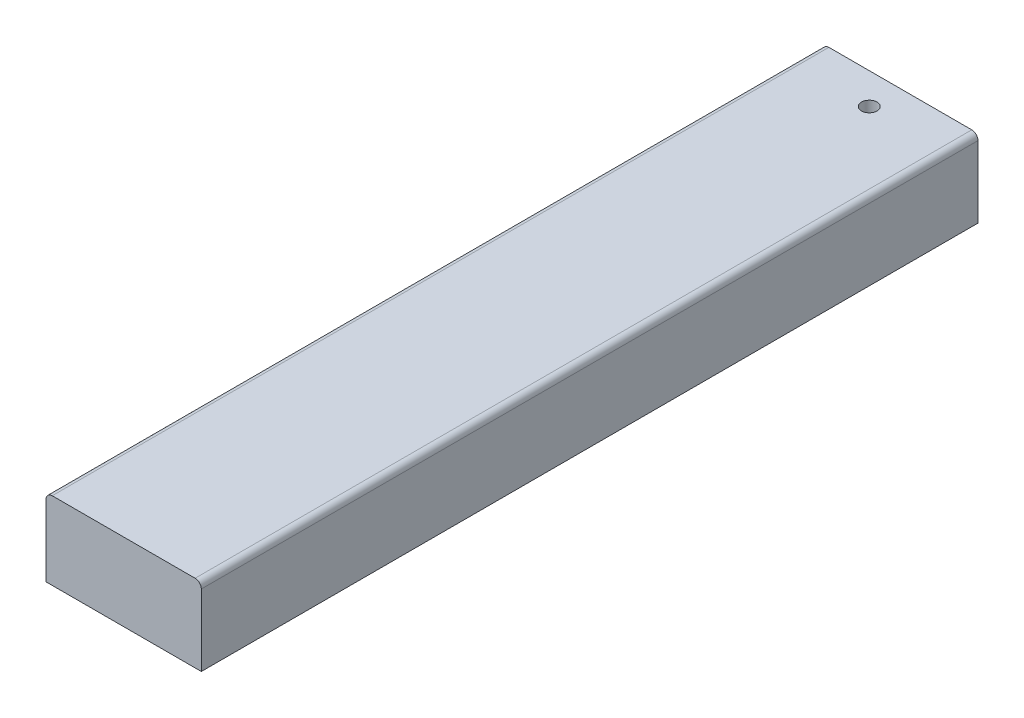
ISO-10303-21;
HEADER;
FILE_DESCRIPTION(('STEP AP214'),'2;1');
FILE_NAME('part.step','',(''),(''),'','','');
FILE_SCHEMA(('AUTOMOTIVE_DESIGN { 1 0 10303 214 1 1 1 1 }'));
ENDSEC;
DATA;
#1=APPLICATION_CONTEXT('core data for automotive mechanical design processes');
#2=APPLICATION_PROTOCOL_DEFINITION('international standard','automotive_design',2000,#1);
#3=PRODUCT_CONTEXT('',#1,'mechanical');
#4=PRODUCT('Part','Part','',(#3));
#5=PRODUCT_RELATED_PRODUCT_CATEGORY('part','',(#4));
#6=PRODUCT_DEFINITION_FORMATION('','',#4);
#7=PRODUCT_DEFINITION_CONTEXT('part definition',#1,'design');
#8=PRODUCT_DEFINITION('design','',#6,#7);
#9=PRODUCT_DEFINITION_SHAPE('','',#8);
#10=(LENGTH_UNIT() NAMED_UNIT(*) SI_UNIT(.MILLI.,.METRE.));
#11=(NAMED_UNIT(*) PLANE_ANGLE_UNIT() SI_UNIT($,.RADIAN.));
#12=(NAMED_UNIT(*) SI_UNIT($,.STERADIAN.) SOLID_ANGLE_UNIT());
#13=UNCERTAINTY_MEASURE_WITH_UNIT(LENGTH_MEASURE(1.E-05),#10,'distance_accuracy_value','');
#14=(GEOMETRIC_REPRESENTATION_CONTEXT(3) GLOBAL_UNCERTAINTY_ASSIGNED_CONTEXT((#13)) GLOBAL_UNIT_ASSIGNED_CONTEXT((#10,
#11,#12)) REPRESENTATION_CONTEXT('',''));
#15=CARTESIAN_POINT('',(0.,0.,0.));
#16=DIRECTION('',(0.,0.,1.));
#17=DIRECTION('',(1.,0.,0.));
#18=AXIS2_PLACEMENT_3D('',#15,#16,#17);
#19=CARTESIAN_POINT('',(-25.,-10.,125.));
#20=DIRECTION('',(1.,0.,0.));
#21=DIRECTION('',(0.,0.,-1.));
#22=AXIS2_PLACEMENT_3D('',#19,#20,#21);
#23=PLANE('',#22);
#24=DIRECTION('',(0.,-1.,0.));
#25=VECTOR('',#24,1.);
#26=CARTESIAN_POINT('',(-25.,-10.,125.));
#27=LINE('',#26,#25);
#28=CARTESIAN_POINT('',(-25.,13.,125.));
#29=VERTEX_POINT('',#28);
#30=CARTESIAN_POINT('',(-25.,-10.,125.));
#31=VERTEX_POINT('',#30);
#32=EDGE_CURVE('E98',#29,#31,#27,.T.);
#33=ORIENTED_EDGE('',*,*,#32,.F.);
#34=DIRECTION('',(0.,0.,1.));
#35=VECTOR('',#34,1.);
#36=CARTESIAN_POINT('',(-25.,13.,125.));
#37=LINE('',#36,#35);
#38=CARTESIAN_POINT('',(-25.,13.,-125.));
#39=VERTEX_POINT('',#38);
#40=EDGE_CURVE('E69',#29,#39,#37,.F.);
#41=ORIENTED_EDGE('',*,*,#40,.T.);
#42=DIRECTION('',(0.,-1.,0.));
#43=VECTOR('',#42,1.);
#44=CARTESIAN_POINT('',(-25.,-10.,-125.));
#45=LINE('',#44,#43);
#46=CARTESIAN_POINT('',(-25.,-10.,-125.));
#47=VERTEX_POINT('',#46);
#48=EDGE_CURVE('E120',#39,#47,#45,.T.);
#49=ORIENTED_EDGE('',*,*,#48,.T.);
#50=DIRECTION('',(0.,0.,-1.));
#51=VECTOR('',#50,1.);
#52=CARTESIAN_POINT('',(-25.,-10.,125.));
#53=LINE('',#52,#51);
#54=EDGE_CURVE('E113',#31,#47,#53,.T.);
#55=ORIENTED_EDGE('',*,*,#54,.F.);
#56=EDGE_LOOP('',(#33,#41,#49,#55));
#57=FACE_BOUND('',#56,.T.);
#58=ADVANCED_FACE('F45',(#57),#23,.F.);
#59=CARTESIAN_POINT('',(25.,-10.,125.));
#60=DIRECTION('',(0.,1.,0.));
#61=DIRECTION('',(0.,0.,1.));
#62=AXIS2_PLACEMENT_3D('',#59,#60,#61);
#63=PLANE('',#62);
#64=DIRECTION('',(1.,0.,0.));
#65=VECTOR('',#64,1.);
#66=CARTESIAN_POINT('',(25.,-10.,-125.));
#67=LINE('',#66,#65);
#68=CARTESIAN_POINT('',(25.,-10.,-125.));
#69=VERTEX_POINT('',#68);
#70=EDGE_CURVE('E209',#47,#69,#67,.T.);
#71=ORIENTED_EDGE('',*,*,#70,.T.);
#72=DIRECTION('',(0.,0.,-1.));
#73=VECTOR('',#72,1.);
#74=CARTESIAN_POINT('',(25.,-10.,125.));
#75=LINE('',#74,#73);
#76=CARTESIAN_POINT('',(25.,-10.,125.));
#77=VERTEX_POINT('',#76);
#78=EDGE_CURVE('E115',#77,#69,#75,.T.);
#79=ORIENTED_EDGE('',*,*,#78,.F.);
#80=DIRECTION('',(1.,0.,0.));
#81=VECTOR('',#80,1.);
#82=CARTESIAN_POINT('',(25.,-10.,125.));
#83=LINE('',#82,#81);
#84=EDGE_CURVE('E103',#31,#77,#83,.T.);
#85=ORIENTED_EDGE('',*,*,#84,.F.);
#86=ORIENTED_EDGE('',*,*,#54,.T.);
#87=EDGE_LOOP('',(#71,#79,#85,#86));
#88=FACE_BOUND('',#87,.T.);
#89=ADVANCED_FACE('F112',(#88),#63,.F.);
#90=CARTESIAN_POINT('',(25.,-10.,125.));
#91=DIRECTION('',(-1.,0.,0.));
#92=DIRECTION('',(0.,0.,1.));
#93=AXIS2_PLACEMENT_3D('',#90,#91,#92);
#94=PLANE('',#93);
#95=DIRECTION('',(0.,1.,0.));
#96=VECTOR('',#95,1.);
#97=CARTESIAN_POINT('',(25.,-10.,-125.));
#98=LINE('',#97,#96);
#99=CARTESIAN_POINT('',(25.,13.,-125.));
#100=VERTEX_POINT('',#99);
#101=EDGE_CURVE('E108',#69,#100,#98,.T.);
#102=ORIENTED_EDGE('',*,*,#101,.T.);
#103=DIRECTION('',(0.,0.,-1.));
#104=VECTOR('',#103,1.);
#105=CARTESIAN_POINT('',(25.,13.,125.));
#106=LINE('',#105,#104);
#107=CARTESIAN_POINT('',(25.,13.,125.));
#108=VERTEX_POINT('',#107);
#109=EDGE_CURVE('E11',#100,#108,#106,.F.);
#110=ORIENTED_EDGE('',*,*,#109,.T.);
#111=DIRECTION('',(0.,1.,0.));
#112=VECTOR('',#111,1.);
#113=CARTESIAN_POINT('',(25.,-10.,125.));
#114=LINE('',#113,#112);
#115=EDGE_CURVE('E118',#77,#108,#114,.T.);
#116=ORIENTED_EDGE('',*,*,#115,.F.);
#117=ORIENTED_EDGE('',*,*,#78,.T.);
#118=EDGE_LOOP('',(#102,#110,#116,#117));
#119=FACE_BOUND('',#118,.T.);
#120=ADVANCED_FACE('F179',(#119),#94,.F.);
#121=CARTESIAN_POINT('',(0.,0.,125.));
#122=DIRECTION('',(0.,0.,1.));
#123=DIRECTION('',(1.,0.,0.));
#124=AXIS2_PLACEMENT_3D('',#121,#122,#123);
#125=PLANE('',#124);
#126=DIRECTION('',(1.,0.,0.));
#127=VECTOR('',#126,1.);
#128=CARTESIAN_POINT('',(25.,15.,125.));
#129=LINE('',#128,#127);
#130=CARTESIAN_POINT('',(-23.,15.,125.));
#131=VERTEX_POINT('',#130);
#132=CARTESIAN_POINT('',(23.,15.,125.));
#133=VERTEX_POINT('',#132);
#134=EDGE_CURVE('E136',#131,#133,#129,.T.);
#135=ORIENTED_EDGE('',*,*,#134,.F.);
#136=CARTESIAN_POINT('',(-23.,13.,125.));
#137=DIRECTION('',(0.,0.,1.));
#138=DIRECTION('',(1.,0.,0.));
#139=AXIS2_PLACEMENT_3D('',#136,#137,#138);
#140=CIRCLE('',#139,2.);
#141=EDGE_CURVE('E105',#131,#29,#140,.T.);
#142=ORIENTED_EDGE('',*,*,#141,.T.);
#143=ORIENTED_EDGE('',*,*,#32,.T.);
#144=ORIENTED_EDGE('',*,*,#84,.T.);
#145=ORIENTED_EDGE('',*,*,#115,.T.);
#146=CARTESIAN_POINT('',(23.,13.,125.));
#147=DIRECTION('',(0.,0.,1.));
#148=DIRECTION('',(1.,0.,0.));
#149=AXIS2_PLACEMENT_3D('',#146,#147,#148);
#150=CIRCLE('',#149,2.);
#151=EDGE_CURVE('E142',#108,#133,#150,.T.);
#152=ORIENTED_EDGE('',*,*,#151,.T.);
#153=EDGE_LOOP('',(#135,#142,#143,#144,#145,#152));
#154=FACE_BOUND('',#153,.T.);
#155=ADVANCED_FACE('F101',(#154),#125,.T.);
#156=CARTESIAN_POINT('',(0.,0.,-125.));
#157=DIRECTION('',(0.,0.,1.));
#158=DIRECTION('',(1.,0.,0.));
#159=AXIS2_PLACEMENT_3D('',#156,#157,#158);
#160=PLANE('',#159);
#161=ORIENTED_EDGE('',*,*,#48,.F.);
#162=CARTESIAN_POINT('',(-23.,13.,-125.));
#163=DIRECTION('',(0.,0.,1.));
#164=DIRECTION('',(1.,0.,0.));
#165=AXIS2_PLACEMENT_3D('',#162,#163,#164);
#166=CIRCLE('',#165,2.);
#167=CARTESIAN_POINT('',(-23.,15.,-125.));
#168=VERTEX_POINT('',#167);
#169=EDGE_CURVE('E54',#39,#168,#166,.F.);
#170=ORIENTED_EDGE('',*,*,#169,.T.);
#171=DIRECTION('',(-1.,0.,0.));
#172=VECTOR('',#171,1.);
#173=CARTESIAN_POINT('',(25.,15.,-125.));
#174=LINE('',#173,#172);
#175=CARTESIAN_POINT('',(23.,15.,-125.));
#176=VERTEX_POINT('',#175);
#177=EDGE_CURVE('E154',#176,#168,#174,.T.);
#178=ORIENTED_EDGE('',*,*,#177,.F.);
#179=CARTESIAN_POINT('',(23.,13.,-125.));
#180=DIRECTION('',(0.,0.,1.));
#181=DIRECTION('',(1.,0.,0.));
#182=AXIS2_PLACEMENT_3D('',#179,#180,#181);
#183=CIRCLE('',#182,2.);
#184=EDGE_CURVE('E61',#176,#100,#183,.F.);
#185=ORIENTED_EDGE('',*,*,#184,.T.);
#186=ORIENTED_EDGE('',*,*,#101,.F.);
#187=ORIENTED_EDGE('',*,*,#70,.F.);
#188=EDGE_LOOP('',(#161,#170,#178,#185,#186,#187));
#189=FACE_BOUND('',#188,.T.);
#190=ADVANCED_FACE('F153',(#189),#160,.F.);
#191=CARTESIAN_POINT('',(0.,15.,0.));
#192=DIRECTION('',(0.,-1.,0.));
#193=DIRECTION('',(0.,0.,-1.));
#194=AXIS2_PLACEMENT_3D('',#191,#192,#193);
#195=PLANE('',#194);
#196=CARTESIAN_POINT('',(0.,15.,-115.));
#197=DIRECTION('',(0.,-1.,0.));
#198=DIRECTION('',(0.,0.,-1.));
#199=AXIS2_PLACEMENT_3D('',#196,#197,#198);
#200=CIRCLE('',#199,2.5);
#201=CARTESIAN_POINT('',(0.,15.,-117.5));
#202=VERTEX_POINT('',#201);
#203=EDGE_CURVE('E133',#202,#202,#200,.F.);
#204=ORIENTED_EDGE('',*,*,#203,.F.);
#205=EDGE_LOOP('',(#204));
#206=FACE_BOUND('',#205,.T.);
#207=ORIENTED_EDGE('',*,*,#177,.T.);
#208=DIRECTION('',(0.,0.,1.));
#209=VECTOR('',#208,1.);
#210=CARTESIAN_POINT('',(-23.,15.,0.));
#211=LINE('',#210,#209);
#212=EDGE_CURVE('E128',#168,#131,#211,.T.);
#213=ORIENTED_EDGE('',*,*,#212,.T.);
#214=ORIENTED_EDGE('',*,*,#134,.T.);
#215=DIRECTION('',(0.,0.,-1.));
#216=VECTOR('',#215,1.);
#217=CARTESIAN_POINT('',(23.,15.,0.));
#218=LINE('',#217,#216);
#219=EDGE_CURVE('E123',#133,#176,#218,.T.);
#220=ORIENTED_EDGE('',*,*,#219,.T.);
#221=EDGE_LOOP('',(#207,#213,#214,#220));
#222=FACE_BOUND('',#221,.T.);
#223=ADVANCED_FACE('F158',(#206,#222),#195,.F.);
#224=CARTESIAN_POINT('',(0.,15.000012,-115.));
#225=DIRECTION('',(0.,-1.,0.));
#226=DIRECTION('',(0.,0.,-1.));
#227=AXIS2_PLACEMENT_3D('',#224,#225,#226);
#228=CYLINDRICAL_SURFACE('',#227,2.5);
#229=CARTESIAN_POINT('',(0.,5.,-115.));
#230=DIRECTION('',(0.,1.,0.));
#231=DIRECTION('',(0.,0.,1.));
#232=AXIS2_PLACEMENT_3D('',#229,#230,#231);
#233=CIRCLE('',#232,2.5);
#234=CARTESIAN_POINT('',(0.,5.,-117.5));
#235=VERTEX_POINT('',#234);
#236=EDGE_CURVE('E137',#235,#235,#233,.T.);
#237=CARTESIAN_POINT('',(0.,5.,-117.5));
#238=CARTESIAN_POINT('',(0.,5.10416666666667,-117.5));
#239=CARTESIAN_POINT('',(0.,5.20833333333333,-117.5));
#240=CARTESIAN_POINT('',(0.,5.41666666666667,-117.5));
#241=CARTESIAN_POINT('',(0.,5.52083333333333,-117.5));
#242=CARTESIAN_POINT('',(0.,5.72916666666667,-117.5));
#243=CARTESIAN_POINT('',(0.,5.83333333333333,-117.5));
#244=CARTESIAN_POINT('',(0.,6.04166666666667,-117.5));
#245=CARTESIAN_POINT('',(0.,6.14583333333333,-117.5));
#246=CARTESIAN_POINT('',(0.,6.35416666666667,-117.5));
#247=CARTESIAN_POINT('',(0.,6.45833333333333,-117.5));
#248=CARTESIAN_POINT('',(0.,6.66666666666667,-117.5));
#249=CARTESIAN_POINT('',(0.,6.77083333333333,-117.5));
#250=CARTESIAN_POINT('',(0.,6.97916666666667,-117.5));
#251=CARTESIAN_POINT('',(0.,7.08333333333333,-117.5));
#252=CARTESIAN_POINT('',(0.,7.29166666666667,-117.5));
#253=CARTESIAN_POINT('',(0.,7.39583333333333,-117.5));
#254=CARTESIAN_POINT('',(0.,7.60416666666667,-117.5));
#255=CARTESIAN_POINT('',(0.,7.70833333333333,-117.5));
#256=CARTESIAN_POINT('',(0.,7.91666666666667,-117.5));
#257=CARTESIAN_POINT('',(0.,8.02083333333333,-117.5));
#258=CARTESIAN_POINT('',(0.,8.22916666666667,-117.5));
#259=CARTESIAN_POINT('',(0.,8.33333333333333,-117.5));
#260=CARTESIAN_POINT('',(0.,8.54166666666667,-117.5));
#261=CARTESIAN_POINT('',(0.,8.64583333333333,-117.5));
#262=CARTESIAN_POINT('',(0.,8.85416666666667,-117.5));
#263=CARTESIAN_POINT('',(0.,8.95833333333333,-117.5));
#264=CARTESIAN_POINT('',(0.,9.16666666666666,-117.5));
#265=CARTESIAN_POINT('',(0.,9.27083333333333,-117.5));
#266=CARTESIAN_POINT('',(0.,9.47916666666667,-117.5));
#267=CARTESIAN_POINT('',(0.,9.58333333333333,-117.5));
#268=CARTESIAN_POINT('',(0.,9.79166666666667,-117.5));
#269=CARTESIAN_POINT('',(0.,9.89583333333333,-117.5));
#270=CARTESIAN_POINT('',(0.,10.1041666666667,-117.5));
#271=CARTESIAN_POINT('',(0.,10.2083333333333,-117.5));
#272=CARTESIAN_POINT('',(0.,10.4166666666667,-117.5));
#273=CARTESIAN_POINT('',(0.,10.5208333333333,-117.5));
#274=CARTESIAN_POINT('',(0.,10.7291666666667,-117.5));
#275=CARTESIAN_POINT('',(0.,10.8333333333333,-117.5));
#276=CARTESIAN_POINT('',(0.,11.0416666666667,-117.5));
#277=CARTESIAN_POINT('',(0.,11.1458333333333,-117.5));
#278=CARTESIAN_POINT('',(0.,11.3541666666667,-117.5));
#279=CARTESIAN_POINT('',(0.,11.4583333333333,-117.5));
#280=CARTESIAN_POINT('',(0.,11.6666666666667,-117.5));
#281=CARTESIAN_POINT('',(0.,11.7708333333333,-117.5));
#282=CARTESIAN_POINT('',(0.,11.9791666666667,-117.5));
#283=CARTESIAN_POINT('',(0.,12.0833333333333,-117.5));
#284=CARTESIAN_POINT('',(0.,12.2916666666667,-117.5));
#285=CARTESIAN_POINT('',(0.,12.3958333333333,-117.5));
#286=CARTESIAN_POINT('',(0.,12.6041666666667,-117.5));
#287=CARTESIAN_POINT('',(0.,12.7083333333333,-117.5));
#288=CARTESIAN_POINT('',(0.,12.9166666666667,-117.5));
#289=CARTESIAN_POINT('',(0.,13.0208333333333,-117.5));
#290=CARTESIAN_POINT('',(0.,13.2291666666667,-117.5));
#291=CARTESIAN_POINT('',(0.,13.3333333333333,-117.5));
#292=CARTESIAN_POINT('',(0.,13.5416666666667,-117.5));
#293=CARTESIAN_POINT('',(0.,13.6458333333333,-117.5));
#294=CARTESIAN_POINT('',(0.,13.8541666666667,-117.5));
#295=CARTESIAN_POINT('',(0.,13.9583333333333,-117.5));
#296=CARTESIAN_POINT('',(0.,14.1666666666667,-117.5));
#297=CARTESIAN_POINT('',(0.,14.2708333333333,-117.5));
#298=CARTESIAN_POINT('',(0.,14.4791666666667,-117.5));
#299=CARTESIAN_POINT('',(0.,14.5833333333333,-117.5));
#300=CARTESIAN_POINT('',(0.,14.7916666666667,-117.5));
#301=CARTESIAN_POINT('',(0.,14.8958333333333,-117.5));
#302=CARTESIAN_POINT('',(0.,15.,-117.5));
#303=B_SPLINE_CURVE_WITH_KNOTS('',3,(#237,#238,#239,#240,#241,#242,#243,#244,#245,#246,#247,
#248,#249,#250,#251,#252,#253,#254,#255,#256,#257,#258,#259,#260,#261,#262,#263,#264,#265,#266,
#267,#268,#269,#270,#271,#272,#273,#274,#275,#276,#277,#278,#279,#280,#281,#282,#283,#284,#285,
#286,#287,#288,#289,#290,#291,#292,#293,#294,#295,#296,#297,#298,#299,#300,#301,#302),
.UNSPECIFIED.,.F.,.F.,(4,2,2,2,2,2,2,2,2,2,2,2,2,2,2,2,2,2,2,2,2,2,2,2,2,2,2,2,2,2,2,2,4),(0.,
0.3125,0.625000000000001,0.937500000000001,1.25,1.5625,1.875,2.1875,2.5,2.8125,3.125,3.4375,
3.75,4.0625,4.375,4.6875,5.,5.3125,5.625,5.9375,6.25,6.5625,6.875,7.1875,7.5,7.8125,8.125,
8.4375,8.75,9.0625,9.375,9.6875,10.),.UNSPECIFIED.);
#304=EDGE_CURVE('BSEAM171',#235,#202,#303,.T.);
#305=ORIENTED_EDGE('',*,*,#236,.F.);
#306=ORIENTED_EDGE('',*,*,#203,.T.);
#307=ORIENTED_EDGE('',*,*,#304,.T.);
#308=ORIENTED_EDGE('',*,*,#304,.F.);
#309=EDGE_LOOP('',(#305,#307,#306,#308));
#310=FACE_BOUND('',#309,.T.);
#311=ADVANCED_FACE('F171',(#310),#228,.F.);
#312=CARTESIAN_POINT('',(0.,5.,-115.));
#313=DIRECTION('',(0.,1.,0.));
#314=DIRECTION('',(0.,0.,1.));
#315=AXIS2_PLACEMENT_3D('',#312,#313,#314);
#316=PLANE('',#315);
#317=ORIENTED_EDGE('',*,*,#236,.T.);
#318=EDGE_LOOP('',(#317));
#319=FACE_BOUND('',#318,.T.);
#320=ADVANCED_FACE('F165',(#319),#316,.T.);
#321=CARTESIAN_POINT('',(-23.,13.,0.));
#322=DIRECTION('',(0.,0.,1.));
#323=DIRECTION('',(1.,0.,0.));
#324=AXIS2_PLACEMENT_3D('',#321,#322,#323);
#325=CYLINDRICAL_SURFACE('',#324,2.);
#326=ORIENTED_EDGE('',*,*,#169,.F.);
#327=ORIENTED_EDGE('',*,*,#40,.F.);
#328=ORIENTED_EDGE('',*,*,#141,.F.);
#329=ORIENTED_EDGE('',*,*,#212,.F.);
#330=EDGE_LOOP('',(#326,#327,#328,#329));
#331=FACE_BOUND('',#330,.T.);
#332=ADVANCED_FACE('F163',(#331),#325,.T.);
#333=CARTESIAN_POINT('',(23.,13.,0.));
#334=DIRECTION('',(0.,0.,-1.));
#335=DIRECTION('',(-1.,0.,0.));
#336=AXIS2_PLACEMENT_3D('',#333,#334,#335);
#337=CYLINDRICAL_SURFACE('',#336,2.);
#338=ORIENTED_EDGE('',*,*,#151,.F.);
#339=ORIENTED_EDGE('',*,*,#109,.F.);
#340=ORIENTED_EDGE('',*,*,#184,.F.);
#341=ORIENTED_EDGE('',*,*,#219,.F.);
#342=EDGE_LOOP('',(#338,#339,#340,#341));
#343=FACE_BOUND('',#342,.T.);
#344=ADVANCED_FACE('F47',(#343),#337,.T.);
#345=CLOSED_SHELL('',(#58,#89,#120,#155,#190,#223,#311,#320,#332,#344));
#346=MANIFOLD_SOLID_BREP('B2',#345);
#347=ADVANCED_BREP_SHAPE_REPRESENTATION('',(#18,#346),#14);
#348=SHAPE_DEFINITION_REPRESENTATION(#9,#347);
ENDSEC;
END-ISO-10303-21;
